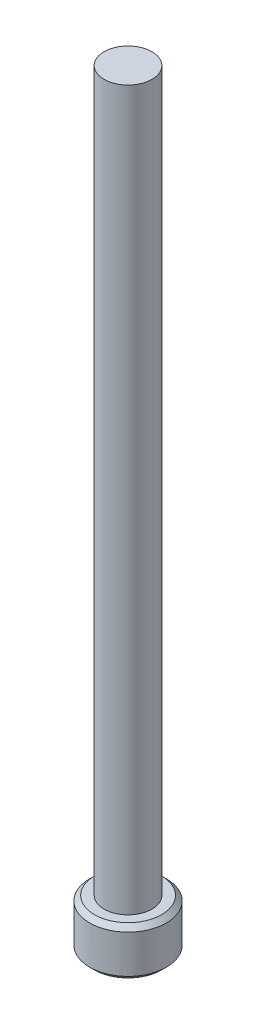
ISO-10303-21;
HEADER;
FILE_DESCRIPTION(('STEP AP214'),'2;1');
FILE_NAME('part.step','',(''),(''),'','','');
FILE_SCHEMA(('AUTOMOTIVE_DESIGN { 1 0 10303 214 1 1 1 1 }'));
ENDSEC;
DATA;
#1=APPLICATION_CONTEXT('core data for automotive mechanical design processes');
#2=APPLICATION_PROTOCOL_DEFINITION('international standard','automotive_design',2000,#1);
#3=PRODUCT_CONTEXT('',#1,'mechanical');
#4=PRODUCT('Part','Part','',(#3));
#5=PRODUCT_RELATED_PRODUCT_CATEGORY('part','',(#4));
#6=PRODUCT_DEFINITION_FORMATION('','',#4);
#7=PRODUCT_DEFINITION_CONTEXT('part definition',#1,'design');
#8=PRODUCT_DEFINITION('design','',#6,#7);
#9=PRODUCT_DEFINITION_SHAPE('','',#8);
#10=(LENGTH_UNIT() NAMED_UNIT(*) SI_UNIT(.MILLI.,.METRE.));
#11=(NAMED_UNIT(*) PLANE_ANGLE_UNIT() SI_UNIT($,.RADIAN.));
#12=(NAMED_UNIT(*) SI_UNIT($,.STERADIAN.) SOLID_ANGLE_UNIT());
#13=UNCERTAINTY_MEASURE_WITH_UNIT(LENGTH_MEASURE(1.E-05),#10,'distance_accuracy_value','');
#14=(GEOMETRIC_REPRESENTATION_CONTEXT(3) GLOBAL_UNCERTAINTY_ASSIGNED_CONTEXT((#13)) GLOBAL_UNIT_ASSIGNED_CONTEXT((#10,
#11,#12)) REPRESENTATION_CONTEXT('',''));
#15=CARTESIAN_POINT('',(0.,0.,0.));
#16=DIRECTION('',(0.,0.,1.));
#17=DIRECTION('',(1.,0.,0.));
#18=AXIS2_PLACEMENT_3D('',#15,#16,#17);
#19=CARTESIAN_POINT('',(0.,75.,0.));
#20=DIRECTION('',(0.,-1.,0.));
#21=DIRECTION('',(0.,0.,-1.));
#22=AXIS2_PLACEMENT_3D('',#19,#20,#21);
#23=CYLINDRICAL_SURFACE('',#22,2.5);
#24=CARTESIAN_POINT('',(0.,75.,0.));
#25=DIRECTION('',(0.,1.,0.));
#26=DIRECTION('',(0.,0.,1.));
#27=AXIS2_PLACEMENT_3D('',#24,#25,#26);
#28=CIRCLE('',#27,2.5);
#29=CARTESIAN_POINT('',(0.,75.,2.5));
#30=VERTEX_POINT('',#29);
#31=EDGE_CURVE('E126',#30,#30,#28,.T.);
#32=ORIENTED_EDGE('',*,*,#31,.F.);
#33=EDGE_LOOP('',(#32));
#34=FACE_BOUND('',#33,.T.);
#35=CARTESIAN_POINT('',(0.,0.,0.));
#36=DIRECTION('',(0.,-1.,0.));
#37=DIRECTION('',(0.,0.,-1.));
#38=AXIS2_PLACEMENT_3D('',#35,#36,#37);
#39=CIRCLE('',#38,2.5);
#40=CARTESIAN_POINT('',(0.,0.,-2.5));
#41=VERTEX_POINT('',#40);
#42=EDGE_CURVE('E116',#41,#41,#39,.T.);
#43=ORIENTED_EDGE('',*,*,#42,.F.);
#44=EDGE_LOOP('',(#43));
#45=FACE_BOUND('',#44,.T.);
#46=ADVANCED_FACE('F32',(#34,#45),#23,.T.);
#47=CARTESIAN_POINT('',(0.,75.,0.));
#48=DIRECTION('',(0.,1.,0.));
#49=DIRECTION('',(0.,0.,1.));
#50=AXIS2_PLACEMENT_3D('',#47,#48,#49);
#51=PLANE('',#50);
#52=ORIENTED_EDGE('',*,*,#31,.T.);
#53=EDGE_LOOP('',(#52));
#54=FACE_BOUND('',#53,.T.);
#55=ADVANCED_FACE('F184',(#54),#51,.T.);
#56=CARTESIAN_POINT('',(0.,0.,0.));
#57=DIRECTION('',(0.,-1.,0.));
#58=DIRECTION('',(0.,0.,-1.));
#59=AXIS2_PLACEMENT_3D('',#56,#57,#58);
#60=PLANE('',#59);
#61=CARTESIAN_POINT('',(0.,0.,0.));
#62=DIRECTION('',(0.,-1.,0.));
#63=DIRECTION('',(0.,0.,-1.));
#64=AXIS2_PLACEMENT_3D('',#61,#62,#63);
#65=CIRCLE('',#64,3.49999999999998);
#66=CARTESIAN_POINT('',(0.,0.,-3.49999999999998));
#67=VERTEX_POINT('',#66);
#68=EDGE_CURVE('E11',#67,#67,#65,.F.);
#69=ORIENTED_EDGE('',*,*,#68,.T.);
#70=EDGE_LOOP('',(#69));
#71=FACE_BOUND('',#70,.T.);
#72=ORIENTED_EDGE('',*,*,#42,.T.);
#73=EDGE_LOOP('',(#72));
#74=FACE_BOUND('',#73,.T.);
#75=ADVANCED_FACE('F190',(#71,#74),#60,.F.);
#76=CARTESIAN_POINT('',(0.,-5.,0.));
#77=DIRECTION('',(0.,-1.,0.));
#78=DIRECTION('',(0.,0.,-1.));
#79=AXIS2_PLACEMENT_3D('',#76,#77,#78);
#80=CYLINDRICAL_SURFACE('',#79,4.);
#81=CARTESIAN_POINT('',(0.,-4.50000000000001,0.));
#82=DIRECTION('',(0.,1.,0.));
#83=DIRECTION('',(0.,0.,1.));
#84=AXIS2_PLACEMENT_3D('',#81,#82,#83);
#85=CIRCLE('',#84,4.);
#86=CARTESIAN_POINT('',(0.,-4.50000000000001,4.));
#87=VERTEX_POINT('',#86);
#88=EDGE_CURVE('E40',#87,#87,#85,.T.);
#89=ORIENTED_EDGE('',*,*,#88,.T.);
#90=EDGE_LOOP('',(#89));
#91=FACE_BOUND('',#90,.T.);
#92=CARTESIAN_POINT('',(0.,-0.500000000000011,0.));
#93=DIRECTION('',(0.,-1.,0.));
#94=DIRECTION('',(0.,0.,-1.));
#95=AXIS2_PLACEMENT_3D('',#92,#93,#94);
#96=CIRCLE('',#95,4.);
#97=CARTESIAN_POINT('',(0.,-0.500000000000011,-4.));
#98=VERTEX_POINT('',#97);
#99=EDGE_CURVE('E146',#98,#98,#96,.T.);
#100=ORIENTED_EDGE('',*,*,#99,.T.);
#101=EDGE_LOOP('',(#100));
#102=FACE_BOUND('',#101,.T.);
#103=ADVANCED_FACE('F151',(#91,#102),#80,.T.);
#104=CARTESIAN_POINT('',(-4.,-5.,0.));
#105=DIRECTION('',(0.,1.,0.));
#106=DIRECTION('',(0.,0.,1.));
#107=AXIS2_PLACEMENT_3D('',#104,#105,#106);
#108=PLANE('',#107);
#109=CARTESIAN_POINT('',(0.,-5.,0.));
#110=DIRECTION('',(0.,1.,0.));
#111=DIRECTION('',(0.,0.,1.));
#112=AXIS2_PLACEMENT_3D('',#109,#110,#111);
#113=CIRCLE('',#112,3.50000000000001);
#114=CARTESIAN_POINT('',(0.,-5.,3.50000000000001));
#115=VERTEX_POINT('',#114);
#116=EDGE_CURVE('E143',#115,#115,#113,.F.);
#117=ORIENTED_EDGE('',*,*,#116,.T.);
#118=EDGE_LOOP('',(#117));
#119=FACE_BOUND('',#118,.T.);
#120=DIRECTION('',(1.,0.,0.));
#121=VECTOR('',#120,1.);
#122=CARTESIAN_POINT('',(-4.,-5.,2.5));
#123=LINE('',#122,#121);
#124=CARTESIAN_POINT('',(-1.44337567297406,-5.,2.5));
#125=VERTEX_POINT('',#124);
#126=CARTESIAN_POINT('',(1.44337567297407,-5.,2.5));
#127=VERTEX_POINT('',#126);
#128=EDGE_CURVE('E139',#125,#127,#123,.T.);
#129=ORIENTED_EDGE('',*,*,#128,.T.);
#130=DIRECTION('',(0.5,0.,-0.866025403784439));
#131=VECTOR('',#130,1.);
#132=CARTESIAN_POINT('',(1.1650635094611,-5.,2.98205080756888));
#133=LINE('',#132,#131);
#134=CARTESIAN_POINT('',(2.88675134594813,-5.,0.));
#135=VERTEX_POINT('',#134);
#136=EDGE_CURVE('E55',#127,#135,#133,.T.);
#137=ORIENTED_EDGE('',*,*,#136,.T.);
#138=DIRECTION('',(-0.5,0.,-0.866025403784439));
#139=VECTOR('',#138,1.);
#140=CARTESIAN_POINT('',(1.1650635094611,-5.,-2.98205080756888));
#141=LINE('',#140,#139);
#142=CARTESIAN_POINT('',(1.44337567297406,-5.,-2.5));
#143=VERTEX_POINT('',#142);
#144=EDGE_CURVE('E88',#135,#143,#141,.T.);
#145=ORIENTED_EDGE('',*,*,#144,.T.);
#146=DIRECTION('',(-1.,0.,0.));
#147=VECTOR('',#146,1.);
#148=CARTESIAN_POINT('',(-4.,-5.,-2.5));
#149=LINE('',#148,#147);
#150=CARTESIAN_POINT('',(-1.44337567297406,-5.,-2.5));
#151=VERTEX_POINT('',#150);
#152=EDGE_CURVE('E130',#143,#151,#149,.T.);
#153=ORIENTED_EDGE('',*,*,#152,.T.);
#154=DIRECTION('',(-0.5,0.,0.866025403784439));
#155=VECTOR('',#154,1.);
#156=CARTESIAN_POINT('',(-3.1650635094611,-5.,0.482050807568877));
#157=LINE('',#156,#155);
#158=CARTESIAN_POINT('',(-2.88675134594813,-5.,0.));
#159=VERTEX_POINT('',#158);
#160=EDGE_CURVE('E133',#151,#159,#157,.T.);
#161=ORIENTED_EDGE('',*,*,#160,.T.);
#162=DIRECTION('',(0.5,0.,0.866025403784439));
#163=VECTOR('',#162,1.);
#164=CARTESIAN_POINT('',(-3.1650635094611,-5.,-0.482050807568877));
#165=LINE('',#164,#163);
#166=EDGE_CURVE('E136',#159,#125,#165,.T.);
#167=ORIENTED_EDGE('',*,*,#166,.T.);
#168=EDGE_LOOP('',(#129,#137,#145,#153,#161,#167));
#169=FACE_BOUND('',#168,.T.);
#170=ADVANCED_FACE('F159',(#119,#169),#108,.F.);
#171=CARTESIAN_POINT('',(1.44337567297407,-31.,2.5));
#172=DIRECTION('',(0.866025403784439,0.,0.5));
#173=DIRECTION('',(0.5,0.,-0.866025403784439));
#174=AXIS2_PLACEMENT_3D('',#171,#172,#173);
#175=PLANE('',#174);
#176=DIRECTION('',(0.,1.,0.));
#177=VECTOR('',#176,1.);
#178=CARTESIAN_POINT('',(1.44337567297407,-31.,2.5));
#179=LINE('',#178,#177);
#180=CARTESIAN_POINT('',(1.44337567297407,-1.,2.5));
#181=VERTEX_POINT('',#180);
#182=EDGE_CURVE('E104',#127,#181,#179,.T.);
#183=ORIENTED_EDGE('',*,*,#182,.T.);
#184=DIRECTION('',(0.5,0.,-0.866025403784439));
#185=VECTOR('',#184,1.);
#186=CARTESIAN_POINT('',(1.44337567297407,-1.,2.5));
#187=LINE('',#186,#185);
#188=CARTESIAN_POINT('',(2.88675134594813,-1.,0.));
#189=VERTEX_POINT('',#188);
#190=EDGE_CURVE('E97',#181,#189,#187,.T.);
#191=ORIENTED_EDGE('',*,*,#190,.T.);
#192=DIRECTION('',(0.,1.,0.));
#193=VECTOR('',#192,1.);
#194=CARTESIAN_POINT('',(2.88675134594813,-31.,0.));
#195=LINE('',#194,#193);
#196=EDGE_CURVE('E83',#135,#189,#195,.T.);
#197=ORIENTED_EDGE('',*,*,#196,.F.);
#198=ORIENTED_EDGE('',*,*,#136,.F.);
#199=EDGE_LOOP('',(#183,#191,#197,#198));
#200=FACE_BOUND('',#199,.T.);
#201=ADVANCED_FACE('F103',(#200),#175,.F.);
#202=CARTESIAN_POINT('',(-1.44337567297406,-31.,2.5));
#203=DIRECTION('',(0.,0.,1.));
#204=DIRECTION('',(1.,0.,0.));
#205=AXIS2_PLACEMENT_3D('',#202,#203,#204);
#206=PLANE('',#205);
#207=DIRECTION('',(0.,1.,0.));
#208=VECTOR('',#207,1.);
#209=CARTESIAN_POINT('',(-1.44337567297406,-31.,2.5));
#210=LINE('',#209,#208);
#211=CARTESIAN_POINT('',(-1.44337567297406,-1.,2.5));
#212=VERTEX_POINT('',#211);
#213=EDGE_CURVE('E117',#125,#212,#210,.T.);
#214=ORIENTED_EDGE('',*,*,#213,.T.);
#215=DIRECTION('',(1.,0.,0.));
#216=VECTOR('',#215,1.);
#217=CARTESIAN_POINT('',(-1.44337567297406,-1.,2.5));
#218=LINE('',#217,#216);
#219=EDGE_CURVE('E90',#212,#181,#218,.T.);
#220=ORIENTED_EDGE('',*,*,#219,.T.);
#221=ORIENTED_EDGE('',*,*,#182,.F.);
#222=ORIENTED_EDGE('',*,*,#128,.F.);
#223=EDGE_LOOP('',(#214,#220,#221,#222));
#224=FACE_BOUND('',#223,.T.);
#225=ADVANCED_FACE('F165',(#224),#206,.F.);
#226=CARTESIAN_POINT('',(-2.88675134594813,-31.,0.));
#227=DIRECTION('',(-0.866025403784439,0.,0.5));
#228=DIRECTION('',(0.5,0.,0.866025403784439));
#229=AXIS2_PLACEMENT_3D('',#226,#227,#228);
#230=PLANE('',#229);
#231=DIRECTION('',(0.,1.,0.));
#232=VECTOR('',#231,1.);
#233=CARTESIAN_POINT('',(-2.88675134594813,-31.,0.));
#234=LINE('',#233,#232);
#235=CARTESIAN_POINT('',(-2.88675134594813,-1.,0.));
#236=VERTEX_POINT('',#235);
#237=EDGE_CURVE('E119',#159,#236,#234,.T.);
#238=ORIENTED_EDGE('',*,*,#237,.T.);
#239=DIRECTION('',(0.5,0.,0.866025403784439));
#240=VECTOR('',#239,1.);
#241=CARTESIAN_POINT('',(-2.88675134594813,-1.,0.));
#242=LINE('',#241,#240);
#243=EDGE_CURVE('E111',#236,#212,#242,.T.);
#244=ORIENTED_EDGE('',*,*,#243,.T.);
#245=ORIENTED_EDGE('',*,*,#213,.F.);
#246=ORIENTED_EDGE('',*,*,#166,.F.);
#247=EDGE_LOOP('',(#238,#244,#245,#246));
#248=FACE_BOUND('',#247,.T.);
#249=ADVANCED_FACE('F167',(#248),#230,.F.);
#250=CARTESIAN_POINT('',(-1.44337567297406,-31.,-2.5));
#251=DIRECTION('',(-0.866025403784439,0.,-0.5));
#252=DIRECTION('',(-0.5,0.,0.866025403784439));
#253=AXIS2_PLACEMENT_3D('',#250,#251,#252);
#254=PLANE('',#253);
#255=DIRECTION('',(0.,1.,0.));
#256=VECTOR('',#255,1.);
#257=CARTESIAN_POINT('',(-1.44337567297406,-31.,-2.5));
#258=LINE('',#257,#256);
#259=CARTESIAN_POINT('',(-1.44337567297406,-1.,-2.5));
#260=VERTEX_POINT('',#259);
#261=EDGE_CURVE('E121',#151,#260,#258,.T.);
#262=ORIENTED_EDGE('',*,*,#261,.T.);
#263=DIRECTION('',(-0.5,0.,0.866025403784439));
#264=VECTOR('',#263,1.);
#265=CARTESIAN_POINT('',(-1.44337567297406,-1.,-2.5));
#266=LINE('',#265,#264);
#267=EDGE_CURVE('E108',#260,#236,#266,.T.);
#268=ORIENTED_EDGE('',*,*,#267,.T.);
#269=ORIENTED_EDGE('',*,*,#237,.F.);
#270=ORIENTED_EDGE('',*,*,#160,.F.);
#271=EDGE_LOOP('',(#262,#268,#269,#270));
#272=FACE_BOUND('',#271,.T.);
#273=ADVANCED_FACE('F171',(#272),#254,.F.);
#274=CARTESIAN_POINT('',(1.44337567297406,-31.,-2.5));
#275=DIRECTION('',(0.,0.,-1.));
#276=DIRECTION('',(-1.,0.,0.));
#277=AXIS2_PLACEMENT_3D('',#274,#275,#276);
#278=PLANE('',#277);
#279=DIRECTION('',(0.,1.,0.));
#280=VECTOR('',#279,1.);
#281=CARTESIAN_POINT('',(1.44337567297406,-31.,-2.5));
#282=LINE('',#281,#280);
#283=CARTESIAN_POINT('',(1.44337567297406,-1.,-2.5));
#284=VERTEX_POINT('',#283);
#285=EDGE_CURVE('E47',#143,#284,#282,.T.);
#286=ORIENTED_EDGE('',*,*,#285,.T.);
#287=DIRECTION('',(-1.,0.,0.));
#288=VECTOR('',#287,1.);
#289=CARTESIAN_POINT('',(1.44337567297406,-1.,-2.5));
#290=LINE('',#289,#288);
#291=EDGE_CURVE('E101',#284,#260,#290,.T.);
#292=ORIENTED_EDGE('',*,*,#291,.T.);
#293=ORIENTED_EDGE('',*,*,#261,.F.);
#294=ORIENTED_EDGE('',*,*,#152,.F.);
#295=EDGE_LOOP('',(#286,#292,#293,#294));
#296=FACE_BOUND('',#295,.T.);
#297=ADVANCED_FACE('F174',(#296),#278,.F.);
#298=CARTESIAN_POINT('',(2.88675134594813,-31.,0.));
#299=DIRECTION('',(0.866025403784438,0.,-0.5));
#300=DIRECTION('',(-0.5,0.,-0.866025403784439));
#301=AXIS2_PLACEMENT_3D('',#298,#299,#300);
#302=PLANE('',#301);
#303=ORIENTED_EDGE('',*,*,#196,.T.);
#304=DIRECTION('',(-0.5,0.,-0.866025403784439));
#305=VECTOR('',#304,1.);
#306=CARTESIAN_POINT('',(2.88675134594813,-1.,0.));
#307=LINE('',#306,#305);
#308=EDGE_CURVE('E86',#189,#284,#307,.T.);
#309=ORIENTED_EDGE('',*,*,#308,.T.);
#310=ORIENTED_EDGE('',*,*,#285,.F.);
#311=ORIENTED_EDGE('',*,*,#144,.F.);
#312=EDGE_LOOP('',(#303,#309,#310,#311));
#313=FACE_BOUND('',#312,.T.);
#314=ADVANCED_FACE('F85',(#313),#302,.F.);
#315=CARTESIAN_POINT('',(0.,-1.,0.));
#316=DIRECTION('',(0.,1.,0.));
#317=DIRECTION('',(0.,0.,1.));
#318=AXIS2_PLACEMENT_3D('',#315,#316,#317);
#319=PLANE('',#318);
#320=ORIENTED_EDGE('',*,*,#190,.F.);
#321=ORIENTED_EDGE('',*,*,#219,.F.);
#322=ORIENTED_EDGE('',*,*,#243,.F.);
#323=ORIENTED_EDGE('',*,*,#267,.F.);
#324=ORIENTED_EDGE('',*,*,#291,.F.);
#325=ORIENTED_EDGE('',*,*,#308,.F.);
#326=EDGE_LOOP('',(#320,#321,#322,#323,#324,#325));
#327=FACE_BOUND('',#326,.T.);
#328=ADVANCED_FACE('F95',(#327),#319,.F.);
#329=CARTESIAN_POINT('',(0.,-5.,0.));
#330=DIRECTION('',(0.,1.,0.));
#331=DIRECTION('',(0.,0.,1.));
#332=AXIS2_PLACEMENT_3D('',#329,#330,#331);
#333=CONICAL_SURFACE('',#332,3.50000000000001,0.785398163397448);
#334=ORIENTED_EDGE('',*,*,#88,.F.);
#335=EDGE_LOOP('',(#334));
#336=FACE_BOUND('',#335,.T.);
#337=ORIENTED_EDGE('',*,*,#116,.F.);
#338=EDGE_LOOP('',(#337));
#339=FACE_BOUND('',#338,.T.);
#340=ADVANCED_FACE('F154',(#336,#339),#333,.T.);
#341=CARTESIAN_POINT('',(0.,-0.500000000000011,0.));
#342=DIRECTION('',(0.,-1.,0.));
#343=DIRECTION('',(0.,0.,-1.));
#344=AXIS2_PLACEMENT_3D('',#341,#342,#343);
#345=CONICAL_SURFACE('',#344,4.,0.785398163397455);
#346=ORIENTED_EDGE('',*,*,#68,.F.);
#347=EDGE_LOOP('',(#346));
#348=FACE_BOUND('',#347,.T.);
#349=ORIENTED_EDGE('',*,*,#99,.F.);
#350=EDGE_LOOP('',(#349));
#351=FACE_BOUND('',#350,.T.);
#352=ADVANCED_FACE('F34',(#348,#351),#345,.T.);
#353=CLOSED_SHELL('',(#46,#55,#75,#103,#170,#201,#225,#249,#273,#297,#314,#328,#340,#352));
#354=MANIFOLD_SOLID_BREP('B2',#353);
#355=ADVANCED_BREP_SHAPE_REPRESENTATION('',(#18,#354),#14);
#356=SHAPE_DEFINITION_REPRESENTATION(#9,#355);
ENDSEC;
END-ISO-10303-21;
